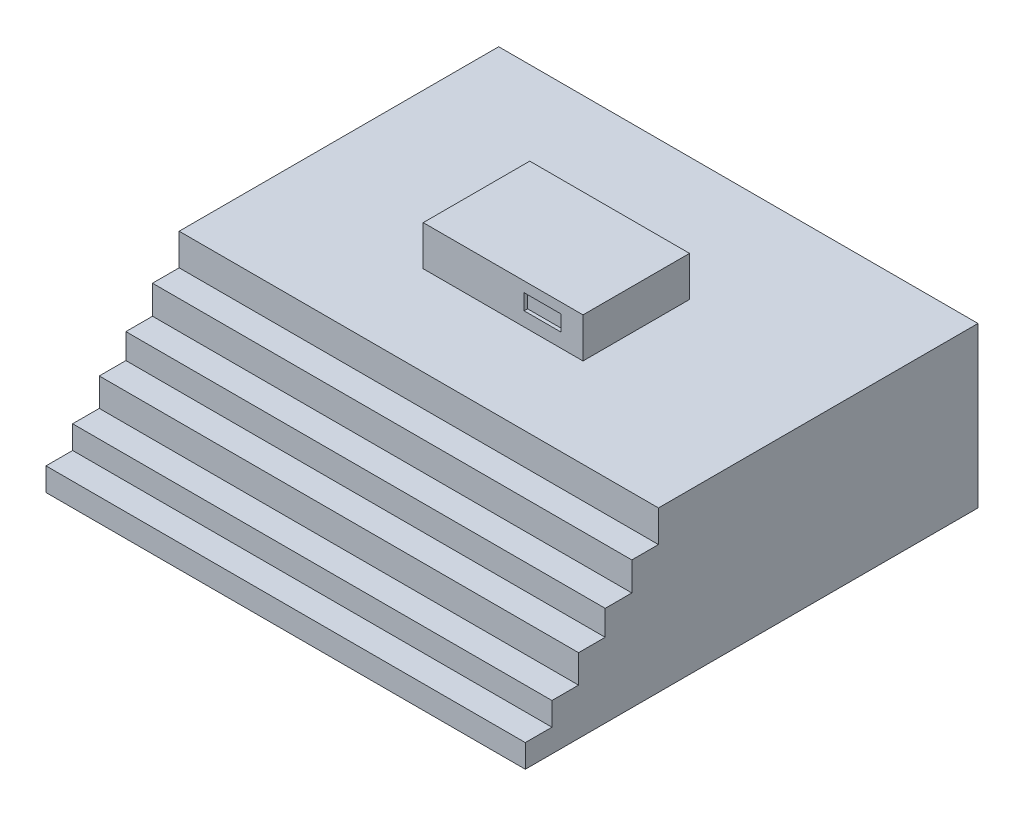
ISO-10303-21;
HEADER;
FILE_DESCRIPTION(('STEP AP214'),'2;1');
FILE_NAME('part.step','',(''),(''),'','','');
FILE_SCHEMA(('AUTOMOTIVE_DESIGN { 1 0 10303 214 1 1 1 1 }'));
ENDSEC;
DATA;
#1=APPLICATION_CONTEXT('core data for automotive mechanical design processes');
#2=APPLICATION_PROTOCOL_DEFINITION('international standard','automotive_design',2000,#1);
#3=PRODUCT_CONTEXT('',#1,'mechanical');
#4=PRODUCT('Part','Part','',(#3));
#5=PRODUCT_RELATED_PRODUCT_CATEGORY('part','',(#4));
#6=PRODUCT_DEFINITION_FORMATION('','',#4);
#7=PRODUCT_DEFINITION_CONTEXT('part definition',#1,'design');
#8=PRODUCT_DEFINITION('design','',#6,#7);
#9=PRODUCT_DEFINITION_SHAPE('','',#8);
#10=(LENGTH_UNIT() NAMED_UNIT(*) SI_UNIT(.MILLI.,.METRE.));
#11=(NAMED_UNIT(*) PLANE_ANGLE_UNIT() SI_UNIT($,.RADIAN.));
#12=(NAMED_UNIT(*) SI_UNIT($,.STERADIAN.) SOLID_ANGLE_UNIT());
#13=UNCERTAINTY_MEASURE_WITH_UNIT(LENGTH_MEASURE(1.E-05),#10,'distance_accuracy_value','');
#14=(GEOMETRIC_REPRESENTATION_CONTEXT(3) GLOBAL_UNCERTAINTY_ASSIGNED_CONTEXT((#13)) GLOBAL_UNIT_ASSIGNED_CONTEXT((#10,
#11,#12)) REPRESENTATION_CONTEXT('',''));
#15=CARTESIAN_POINT('',(0.,0.,0.));
#16=DIRECTION('',(0.,0.,1.));
#17=DIRECTION('',(1.,0.,0.));
#18=AXIS2_PLACEMENT_3D('',#15,#16,#17);
#19=CARTESIAN_POINT('',(-142.707892523808,785.764976231884,609.6));
#20=DIRECTION('',(0.,-1.,0.));
#21=DIRECTION('',(0.,0.,-1.));
#22=AXIS2_PLACEMENT_3D('',#19,#20,#21);
#23=PLANE('',#22);
#24=DIRECTION('',(-1.,0.,0.));
#25=VECTOR('',#24,1.);
#26=CARTESIAN_POINT('',(-142.707892523808,785.764976231884,0.));
#27=LINE('',#26,#25);
#28=CARTESIAN_POINT('',(771.692107476192,785.764976231884,0.));
#29=VERTEX_POINT('',#28);
#30=CARTESIAN_POINT('',(-142.707892523808,785.764976231884,0.));
#31=VERTEX_POINT('',#30);
#32=EDGE_CURVE('E397',#29,#31,#27,.T.);
#33=ORIENTED_EDGE('',*,*,#32,.T.);
#34=DIRECTION('',(0.,0.,-1.));
#35=VECTOR('',#34,1.);
#36=CARTESIAN_POINT('',(-142.707892523808,785.764976231884,609.6));
#37=LINE('',#36,#35);
#38=CARTESIAN_POINT('',(-142.707892523808,785.764976231884,609.6));
#39=VERTEX_POINT('',#38);
#40=EDGE_CURVE('E403',#39,#31,#37,.T.);
#41=ORIENTED_EDGE('',*,*,#40,.F.);
#42=DIRECTION('',(-1.,0.,0.));
#43=VECTOR('',#42,1.);
#44=CARTESIAN_POINT('',(-142.707892523808,785.764976231884,609.6));
#45=LINE('',#44,#43);
#46=CARTESIAN_POINT('',(771.692107476192,785.764976231884,609.6));
#47=VERTEX_POINT('',#46);
#48=EDGE_CURVE('E400',#47,#39,#45,.T.);
#49=ORIENTED_EDGE('',*,*,#48,.F.);
#50=DIRECTION('',(0.,0.,-1.));
#51=VECTOR('',#50,1.);
#52=CARTESIAN_POINT('',(771.692107476192,785.764976231884,609.6));
#53=LINE('',#52,#51);
#54=EDGE_CURVE('E418',#47,#29,#53,.T.);
#55=ORIENTED_EDGE('',*,*,#54,.T.);
#56=EDGE_LOOP('',(#33,#41,#49,#55));
#57=FACE_BOUND('',#56,.T.);
#58=DIRECTION('',(1.,0.,0.));
#59=VECTOR('',#58,1.);
#60=CARTESIAN_POINT('',(152.140679120784,785.764976231884,438.795909304022));
#61=LINE('',#60,#59);
#62=CARTESIAN_POINT('',(152.140679120784,785.764976231884,438.795909304022));
#63=VERTEX_POINT('',#62);
#64=CARTESIAN_POINT('',(456.940679120784,785.764976231884,438.795909304022));
#65=VERTEX_POINT('',#64);
#66=EDGE_CURVE('E65',#63,#65,#61,.T.);
#67=ORIENTED_EDGE('',*,*,#66,.F.);
#68=DIRECTION('',(0.,0.,1.));
#69=VECTOR('',#68,1.);
#70=CARTESIAN_POINT('',(152.140679120784,785.764976231884,235.595909304022));
#71=LINE('',#70,#69);
#72=CARTESIAN_POINT('',(152.140679120784,785.764976231884,235.595909304022));
#73=VERTEX_POINT('',#72);
#74=EDGE_CURVE('E247',#73,#63,#71,.T.);
#75=ORIENTED_EDGE('',*,*,#74,.F.);
#76=DIRECTION('',(1.,0.,0.));
#77=VECTOR('',#76,1.);
#78=CARTESIAN_POINT('',(152.140679120784,785.764976231884,235.595909304022));
#79=LINE('',#78,#77);
#80=CARTESIAN_POINT('',(456.940679120784,785.764976231884,235.595909304022));
#81=VERTEX_POINT('',#80);
#82=EDGE_CURVE('E265',#73,#81,#79,.T.);
#83=ORIENTED_EDGE('',*,*,#82,.T.);
#84=DIRECTION('',(0.,0.,1.));
#85=VECTOR('',#84,1.);
#86=CARTESIAN_POINT('',(456.940679120784,785.764976231884,235.595909304022));
#87=LINE('',#86,#85);
#88=EDGE_CURVE('E261',#81,#65,#87,.T.);
#89=ORIENTED_EDGE('',*,*,#88,.T.);
#90=EDGE_LOOP('',(#67,#75,#83,#89));
#91=FACE_BOUND('',#90,.T.);
#92=ADVANCED_FACE('F41',(#57,#91),#23,.F.);
#93=CARTESIAN_POINT('',(-142.707892523808,785.764976231884,609.6));
#94=DIRECTION('',(1.,0.,0.));
#95=DIRECTION('',(0.,0.,-1.));
#96=AXIS2_PLACEMENT_3D('',#93,#94,#95);
#97=PLANE('',#96);
#98=DIRECTION('',(0.,-1.,0.));
#99=VECTOR('',#98,1.);
#100=CARTESIAN_POINT('',(-142.707892523808,785.764976231884,0.));
#101=LINE('',#100,#99);
#102=CARTESIAN_POINT('',(-142.707892523808,480.964976231884,0.));
#103=VERTEX_POINT('',#102);
#104=EDGE_CURVE('E392',#31,#103,#101,.T.);
#105=ORIENTED_EDGE('',*,*,#104,.T.);
#106=DIRECTION('',(0.,0.,-1.));
#107=VECTOR('',#106,1.);
#108=CARTESIAN_POINT('',(-142.707892523808,480.964976231884,609.6));
#109=LINE('',#108,#107);
#110=CARTESIAN_POINT('',(-142.707892523808,480.964976231884,863.6));
#111=VERTEX_POINT('',#110);
#112=EDGE_CURVE('E11',#111,#103,#109,.T.);
#113=ORIENTED_EDGE('',*,*,#112,.F.);
#114=DIRECTION('',(0.,-1.,0.));
#115=VECTOR('',#114,1.);
#116=CARTESIAN_POINT('',(-142.707892523808,525.094881255979,863.6));
#117=LINE('',#116,#115);
#118=CARTESIAN_POINT('',(-142.707892523808,525.094881255979,863.6));
#119=VERTEX_POINT('',#118);
#120=EDGE_CURVE('E283',#119,#111,#117,.T.);
#121=ORIENTED_EDGE('',*,*,#120,.F.);
#122=DIRECTION('',(0.,0.,-1.));
#123=VECTOR('',#122,1.);
#124=CARTESIAN_POINT('',(-142.707892523808,525.094881255979,863.6));
#125=LINE('',#124,#123);
#126=CARTESIAN_POINT('',(-142.707892523808,525.094881255979,812.8));
#127=VERTEX_POINT('',#126);
#128=EDGE_CURVE('E297',#119,#127,#125,.T.);
#129=ORIENTED_EDGE('',*,*,#128,.T.);
#130=DIRECTION('',(0.,-1.,0.));
#131=VECTOR('',#130,1.);
#132=CARTESIAN_POINT('',(-142.707892523808,569.224786280074,812.8));
#133=LINE('',#132,#131);
#134=CARTESIAN_POINT('',(-142.707892523808,569.224786280074,812.8));
#135=VERTEX_POINT('',#134);
#136=EDGE_CURVE('E309',#135,#127,#133,.T.);
#137=ORIENTED_EDGE('',*,*,#136,.F.);
#138=DIRECTION('',(0.,0.,-1.));
#139=VECTOR('',#138,1.);
#140=CARTESIAN_POINT('',(-142.707892523808,569.224786280074,812.8));
#141=LINE('',#140,#139);
#142=CARTESIAN_POINT('',(-142.707892523808,569.224786280074,762.));
#143=VERTEX_POINT('',#142);
#144=EDGE_CURVE('E318',#135,#143,#141,.T.);
#145=ORIENTED_EDGE('',*,*,#144,.T.);
#146=DIRECTION('',(0.,-1.,0.));
#147=VECTOR('',#146,1.);
#148=CARTESIAN_POINT('',(-142.707892523808,622.834497284574,762.));
#149=LINE('',#148,#147);
#150=CARTESIAN_POINT('',(-142.707892523808,622.834497284574,762.));
#151=VERTEX_POINT('',#150);
#152=EDGE_CURVE('E330',#151,#143,#149,.T.);
#153=ORIENTED_EDGE('',*,*,#152,.F.);
#154=DIRECTION('',(0.,0.,-1.));
#155=VECTOR('',#154,1.);
#156=CARTESIAN_POINT('',(-142.707892523808,622.834497284574,762.));
#157=LINE('',#156,#155);
#158=CARTESIAN_POINT('',(-142.707892523808,622.834497284574,711.2));
#159=VERTEX_POINT('',#158);
#160=EDGE_CURVE('E339',#151,#159,#157,.T.);
#161=ORIENTED_EDGE('',*,*,#160,.T.);
#162=DIRECTION('',(0.,-1.,0.));
#163=VECTOR('',#162,1.);
#164=CARTESIAN_POINT('',(-142.707892523808,670.700310681449,711.2));
#165=LINE('',#164,#163);
#166=CARTESIAN_POINT('',(-142.707892523808,670.700310681449,711.2));
#167=VERTEX_POINT('',#166);
#168=EDGE_CURVE('E351',#167,#159,#165,.T.);
#169=ORIENTED_EDGE('',*,*,#168,.F.);
#170=DIRECTION('',(0.,0.,-1.));
#171=VECTOR('',#170,1.);
#172=CARTESIAN_POINT('',(-142.707892523808,670.700310681449,711.2));
#173=LINE('',#172,#171);
#174=CARTESIAN_POINT('',(-142.707892523808,670.700310681449,660.4));
#175=VERTEX_POINT('',#174);
#176=EDGE_CURVE('E360',#167,#175,#173,.T.);
#177=ORIENTED_EDGE('',*,*,#176,.T.);
#178=DIRECTION('',(0.,-1.,0.));
#179=VECTOR('',#178,1.);
#180=CARTESIAN_POINT('',(-142.707892523808,725.267337953888,660.4));
#181=LINE('',#180,#179);
#182=CARTESIAN_POINT('',(-142.707892523808,725.267337953888,660.4));
#183=VERTEX_POINT('',#182);
#184=EDGE_CURVE('E372',#183,#175,#181,.T.);
#185=ORIENTED_EDGE('',*,*,#184,.F.);
#186=DIRECTION('',(0.,0.,-1.));
#187=VECTOR('',#186,1.);
#188=CARTESIAN_POINT('',(-142.707892523808,725.267337953888,660.4));
#189=LINE('',#188,#187);
#190=CARTESIAN_POINT('',(-142.707892523808,725.267337953888,609.6));
#191=VERTEX_POINT('',#190);
#192=EDGE_CURVE('E381',#183,#191,#189,.T.);
#193=ORIENTED_EDGE('',*,*,#192,.T.);
#194=DIRECTION('',(0.,-1.,0.));
#195=VECTOR('',#194,1.);
#196=CARTESIAN_POINT('',(-142.707892523808,785.764976231884,609.6));
#197=LINE('',#196,#195);
#198=EDGE_CURVE('E393',#39,#191,#197,.T.);
#199=ORIENTED_EDGE('',*,*,#198,.F.);
#200=ORIENTED_EDGE('',*,*,#40,.T.);
#201=EDGE_LOOP('',(#105,#113,#121,#129,#137,#145,#153,#161,#169,#177,#185,#193,#199,#200));
#202=FACE_BOUND('',#201,.T.);
#203=ADVANCED_FACE('F43',(#202),#97,.F.);
#204=CARTESIAN_POINT('',(-142.707892523808,480.964976231884,609.6));
#205=DIRECTION('',(0.,1.,0.));
#206=DIRECTION('',(-1.,0.,0.));
#207=AXIS2_PLACEMENT_3D('',#204,#205,#206);
#208=PLANE('',#207);
#209=DIRECTION('',(1.,0.,0.));
#210=VECTOR('',#209,1.);
#211=CARTESIAN_POINT('',(-142.707892523808,480.964976231884,0.));
#212=LINE('',#211,#210);
#213=CARTESIAN_POINT('',(771.692107476192,480.964976231884,0.));
#214=VERTEX_POINT('',#213);
#215=EDGE_CURVE('E407',#103,#214,#212,.T.);
#216=ORIENTED_EDGE('',*,*,#215,.T.);
#217=DIRECTION('',(0.,0.,-1.));
#218=VECTOR('',#217,1.);
#219=CARTESIAN_POINT('',(771.692107476192,480.964976231884,609.6));
#220=LINE('',#219,#218);
#221=CARTESIAN_POINT('',(771.692107476192,480.964976231884,863.6));
#222=VERTEX_POINT('',#221);
#223=EDGE_CURVE('E50',#222,#214,#220,.T.);
#224=ORIENTED_EDGE('',*,*,#223,.F.);
#225=DIRECTION('',(1.,0.,0.));
#226=VECTOR('',#225,1.);
#227=CARTESIAN_POINT('',(-142.707892523808,480.964976231884,863.6));
#228=LINE('',#227,#226);
#229=EDGE_CURVE('E287',#111,#222,#228,.T.);
#230=ORIENTED_EDGE('',*,*,#229,.F.);
#231=ORIENTED_EDGE('',*,*,#112,.T.);
#232=EDGE_LOOP('',(#216,#224,#230,#231));
#233=FACE_BOUND('',#232,.T.);
#234=ADVANCED_FACE('F486',(#233),#208,.F.);
#235=CARTESIAN_POINT('',(771.692107476192,785.764976231884,609.6));
#236=DIRECTION('',(-1.,0.,0.));
#237=DIRECTION('',(0.,0.,1.));
#238=AXIS2_PLACEMENT_3D('',#235,#236,#237);
#239=PLANE('',#238);
#240=DIRECTION('',(0.,1.,0.));
#241=VECTOR('',#240,1.);
#242=CARTESIAN_POINT('',(771.692107476192,785.764976231884,0.));
#243=LINE('',#242,#241);
#244=EDGE_CURVE('E410',#214,#29,#243,.T.);
#245=ORIENTED_EDGE('',*,*,#244,.T.);
#246=ORIENTED_EDGE('',*,*,#54,.F.);
#247=DIRECTION('',(0.,1.,0.));
#248=VECTOR('',#247,1.);
#249=CARTESIAN_POINT('',(771.692107476192,785.764976231884,609.6));
#250=LINE('',#249,#248);
#251=CARTESIAN_POINT('',(771.692107476192,725.267337953888,609.6));
#252=VERTEX_POINT('',#251);
#253=EDGE_CURVE('E396',#252,#47,#250,.T.);
#254=ORIENTED_EDGE('',*,*,#253,.F.);
#255=DIRECTION('',(0.,0.,-1.));
#256=VECTOR('',#255,1.);
#257=CARTESIAN_POINT('',(771.692107476192,725.267337953888,660.4));
#258=LINE('',#257,#256);
#259=CARTESIAN_POINT('',(771.692107476192,725.267337953888,660.4));
#260=VERTEX_POINT('',#259);
#261=EDGE_CURVE('E388',#260,#252,#258,.T.);
#262=ORIENTED_EDGE('',*,*,#261,.F.);
#263=DIRECTION('',(0.,1.,0.));
#264=VECTOR('',#263,1.);
#265=CARTESIAN_POINT('',(771.692107476192,725.267337953888,660.4));
#266=LINE('',#265,#264);
#267=CARTESIAN_POINT('',(771.692107476192,670.700310681449,660.4));
#268=VERTEX_POINT('',#267);
#269=EDGE_CURVE('E375',#268,#260,#266,.T.);
#270=ORIENTED_EDGE('',*,*,#269,.F.);
#271=DIRECTION('',(0.,0.,-1.));
#272=VECTOR('',#271,1.);
#273=CARTESIAN_POINT('',(771.692107476192,670.700310681449,711.2));
#274=LINE('',#273,#272);
#275=CARTESIAN_POINT('',(771.692107476192,670.700310681449,711.2));
#276=VERTEX_POINT('',#275);
#277=EDGE_CURVE('E367',#276,#268,#274,.T.);
#278=ORIENTED_EDGE('',*,*,#277,.F.);
#279=DIRECTION('',(0.,1.,0.));
#280=VECTOR('',#279,1.);
#281=CARTESIAN_POINT('',(771.692107476192,670.700310681449,711.2));
#282=LINE('',#281,#280);
#283=CARTESIAN_POINT('',(771.692107476192,622.834497284574,711.2));
#284=VERTEX_POINT('',#283);
#285=EDGE_CURVE('E354',#284,#276,#282,.T.);
#286=ORIENTED_EDGE('',*,*,#285,.F.);
#287=DIRECTION('',(0.,0.,-1.));
#288=VECTOR('',#287,1.);
#289=CARTESIAN_POINT('',(771.692107476192,622.834497284574,762.));
#290=LINE('',#289,#288);
#291=CARTESIAN_POINT('',(771.692107476192,622.834497284574,762.));
#292=VERTEX_POINT('',#291);
#293=EDGE_CURVE('E346',#292,#284,#290,.T.);
#294=ORIENTED_EDGE('',*,*,#293,.F.);
#295=DIRECTION('',(0.,1.,0.));
#296=VECTOR('',#295,1.);
#297=CARTESIAN_POINT('',(771.692107476192,622.834497284574,762.));
#298=LINE('',#297,#296);
#299=CARTESIAN_POINT('',(771.692107476192,569.224786280074,762.));
#300=VERTEX_POINT('',#299);
#301=EDGE_CURVE('E333',#300,#292,#298,.T.);
#302=ORIENTED_EDGE('',*,*,#301,.F.);
#303=DIRECTION('',(0.,0.,-1.));
#304=VECTOR('',#303,1.);
#305=CARTESIAN_POINT('',(771.692107476192,569.224786280074,812.8));
#306=LINE('',#305,#304);
#307=CARTESIAN_POINT('',(771.692107476192,569.224786280074,812.8));
#308=VERTEX_POINT('',#307);
#309=EDGE_CURVE('E325',#308,#300,#306,.T.);
#310=ORIENTED_EDGE('',*,*,#309,.F.);
#311=DIRECTION('',(0.,1.,0.));
#312=VECTOR('',#311,1.);
#313=CARTESIAN_POINT('',(771.692107476192,569.224786280074,812.8));
#314=LINE('',#313,#312);
#315=CARTESIAN_POINT('',(771.692107476192,525.094881255979,812.8));
#316=VERTEX_POINT('',#315);
#317=EDGE_CURVE('E312',#316,#308,#314,.T.);
#318=ORIENTED_EDGE('',*,*,#317,.F.);
#319=DIRECTION('',(0.,0.,-1.));
#320=VECTOR('',#319,1.);
#321=CARTESIAN_POINT('',(771.692107476192,525.094881255979,863.6));
#322=LINE('',#321,#320);
#323=CARTESIAN_POINT('',(771.692107476192,525.094881255979,863.6));
#324=VERTEX_POINT('',#323);
#325=EDGE_CURVE('E304',#324,#316,#322,.T.);
#326=ORIENTED_EDGE('',*,*,#325,.F.);
#327=DIRECTION('',(0.,1.,0.));
#328=VECTOR('',#327,1.);
#329=CARTESIAN_POINT('',(771.692107476192,525.094881255979,863.6));
#330=LINE('',#329,#328);
#331=EDGE_CURVE('E291',#222,#324,#330,.T.);
#332=ORIENTED_EDGE('',*,*,#331,.F.);
#333=ORIENTED_EDGE('',*,*,#223,.T.);
#334=EDGE_LOOP('',(#245,#246,#254,#262,#270,#278,#286,#294,#302,#310,#318,#326,#332,#333));
#335=FACE_BOUND('',#334,.T.);
#336=ADVANCED_FACE('F426',(#335),#239,.F.);
#337=CARTESIAN_POINT('',(0.,0.,609.6));
#338=DIRECTION('',(0.,0.,1.));
#339=DIRECTION('',(1.,0.,0.));
#340=AXIS2_PLACEMENT_3D('',#337,#338,#339);
#341=PLANE('',#340);
#342=DIRECTION('',(-1.,0.,0.));
#343=VECTOR('',#342,1.);
#344=CARTESIAN_POINT('',(-142.707892523808,725.267337953888,609.6));
#345=LINE('',#344,#343);
#346=EDGE_CURVE('E371',#252,#191,#345,.T.);
#347=ORIENTED_EDGE('',*,*,#346,.F.);
#348=ORIENTED_EDGE('',*,*,#253,.T.);
#349=ORIENTED_EDGE('',*,*,#48,.T.);
#350=ORIENTED_EDGE('',*,*,#198,.T.);
#351=EDGE_LOOP('',(#347,#348,#349,#350));
#352=FACE_BOUND('',#351,.T.);
#353=ADVANCED_FACE('F444',(#352),#341,.T.);
#354=CARTESIAN_POINT('',(0.,0.,0.));
#355=DIRECTION('',(0.,0.,1.));
#356=DIRECTION('',(1.,0.,0.));
#357=AXIS2_PLACEMENT_3D('',#354,#355,#356);
#358=PLANE('',#357);
#359=ORIENTED_EDGE('',*,*,#104,.F.);
#360=ORIENTED_EDGE('',*,*,#32,.F.);
#361=ORIENTED_EDGE('',*,*,#244,.F.);
#362=ORIENTED_EDGE('',*,*,#215,.F.);
#363=EDGE_LOOP('',(#359,#360,#361,#362));
#364=FACE_BOUND('',#363,.T.);
#365=ADVANCED_FACE('F434',(#364),#358,.F.);
#366=CARTESIAN_POINT('',(-142.707892523808,725.267337953888,660.4));
#367=DIRECTION('',(0.,-1.,0.));
#368=DIRECTION('',(0.,0.,-1.));
#369=AXIS2_PLACEMENT_3D('',#366,#367,#368);
#370=PLANE('',#369);
#371=ORIENTED_EDGE('',*,*,#346,.T.);
#372=ORIENTED_EDGE('',*,*,#192,.F.);
#373=DIRECTION('',(-1.,0.,0.));
#374=VECTOR('',#373,1.);
#375=CARTESIAN_POINT('',(-142.707892523808,725.267337953888,660.4));
#376=LINE('',#375,#374);
#377=EDGE_CURVE('E378',#260,#183,#376,.T.);
#378=ORIENTED_EDGE('',*,*,#377,.F.);
#379=ORIENTED_EDGE('',*,*,#261,.T.);
#380=EDGE_LOOP('',(#371,#372,#378,#379));
#381=FACE_BOUND('',#380,.T.);
#382=ADVANCED_FACE('F447',(#381),#370,.F.);
#383=CARTESIAN_POINT('',(0.,0.,660.4));
#384=DIRECTION('',(0.,0.,1.));
#385=DIRECTION('',(1.,0.,0.));
#386=AXIS2_PLACEMENT_3D('',#383,#384,#385);
#387=PLANE('',#386);
#388=DIRECTION('',(-1.,0.,0.));
#389=VECTOR('',#388,1.);
#390=CARTESIAN_POINT('',(-142.707892523808,670.700310681449,660.4));
#391=LINE('',#390,#389);
#392=EDGE_CURVE('E350',#268,#175,#391,.T.);
#393=ORIENTED_EDGE('',*,*,#392,.F.);
#394=ORIENTED_EDGE('',*,*,#269,.T.);
#395=ORIENTED_EDGE('',*,*,#377,.T.);
#396=ORIENTED_EDGE('',*,*,#184,.T.);
#397=EDGE_LOOP('',(#393,#394,#395,#396));
#398=FACE_BOUND('',#397,.T.);
#399=ADVANCED_FACE('F487',(#398),#387,.T.);
#400=CARTESIAN_POINT('',(-142.707892523808,670.700310681449,711.2));
#401=DIRECTION('',(0.,-1.,0.));
#402=DIRECTION('',(0.,0.,-1.));
#403=AXIS2_PLACEMENT_3D('',#400,#401,#402);
#404=PLANE('',#403);
#405=ORIENTED_EDGE('',*,*,#392,.T.);
#406=ORIENTED_EDGE('',*,*,#176,.F.);
#407=DIRECTION('',(-1.,0.,0.));
#408=VECTOR('',#407,1.);
#409=CARTESIAN_POINT('',(-142.707892523808,670.700310681449,711.2));
#410=LINE('',#409,#408);
#411=EDGE_CURVE('E357',#276,#167,#410,.T.);
#412=ORIENTED_EDGE('',*,*,#411,.F.);
#413=ORIENTED_EDGE('',*,*,#277,.T.);
#414=EDGE_LOOP('',(#405,#406,#412,#413));
#415=FACE_BOUND('',#414,.T.);
#416=ADVANCED_FACE('F456',(#415),#404,.F.);
#417=CARTESIAN_POINT('',(0.,0.,711.2));
#418=DIRECTION('',(0.,0.,1.));
#419=DIRECTION('',(1.,0.,0.));
#420=AXIS2_PLACEMENT_3D('',#417,#418,#419);
#421=PLANE('',#420);
#422=DIRECTION('',(-1.,0.,0.));
#423=VECTOR('',#422,1.);
#424=CARTESIAN_POINT('',(-142.707892523808,622.834497284574,711.2));
#425=LINE('',#424,#423);
#426=EDGE_CURVE('E329',#284,#159,#425,.T.);
#427=ORIENTED_EDGE('',*,*,#426,.F.);
#428=ORIENTED_EDGE('',*,*,#285,.T.);
#429=ORIENTED_EDGE('',*,*,#411,.T.);
#430=ORIENTED_EDGE('',*,*,#168,.T.);
#431=EDGE_LOOP('',(#427,#428,#429,#430));
#432=FACE_BOUND('',#431,.T.);
#433=ADVANCED_FACE('F460',(#432),#421,.T.);
#434=CARTESIAN_POINT('',(-142.707892523808,622.834497284574,762.));
#435=DIRECTION('',(0.,-1.,0.));
#436=DIRECTION('',(0.,0.,-1.));
#437=AXIS2_PLACEMENT_3D('',#434,#435,#436);
#438=PLANE('',#437);
#439=ORIENTED_EDGE('',*,*,#426,.T.);
#440=ORIENTED_EDGE('',*,*,#160,.F.);
#441=DIRECTION('',(-1.,0.,0.));
#442=VECTOR('',#441,1.);
#443=CARTESIAN_POINT('',(-142.707892523808,622.834497284574,762.));
#444=LINE('',#443,#442);
#445=EDGE_CURVE('E336',#292,#151,#444,.T.);
#446=ORIENTED_EDGE('',*,*,#445,.F.);
#447=ORIENTED_EDGE('',*,*,#293,.T.);
#448=EDGE_LOOP('',(#439,#440,#446,#447));
#449=FACE_BOUND('',#448,.T.);
#450=ADVANCED_FACE('F465',(#449),#438,.F.);
#451=CARTESIAN_POINT('',(0.,0.,762.));
#452=DIRECTION('',(0.,0.,1.));
#453=DIRECTION('',(1.,0.,0.));
#454=AXIS2_PLACEMENT_3D('',#451,#452,#453);
#455=PLANE('',#454);
#456=DIRECTION('',(-1.,0.,0.));
#457=VECTOR('',#456,1.);
#458=CARTESIAN_POINT('',(-142.707892523808,569.224786280074,762.));
#459=LINE('',#458,#457);
#460=EDGE_CURVE('E308',#300,#143,#459,.T.);
#461=ORIENTED_EDGE('',*,*,#460,.F.);
#462=ORIENTED_EDGE('',*,*,#301,.T.);
#463=ORIENTED_EDGE('',*,*,#445,.T.);
#464=ORIENTED_EDGE('',*,*,#152,.T.);
#465=EDGE_LOOP('',(#461,#462,#463,#464));
#466=FACE_BOUND('',#465,.T.);
#467=ADVANCED_FACE('F469',(#466),#455,.T.);
#468=CARTESIAN_POINT('',(-142.707892523808,569.224786280074,812.8));
#469=DIRECTION('',(0.,-1.,0.));
#470=DIRECTION('',(0.,0.,-1.));
#471=AXIS2_PLACEMENT_3D('',#468,#469,#470);
#472=PLANE('',#471);
#473=ORIENTED_EDGE('',*,*,#460,.T.);
#474=ORIENTED_EDGE('',*,*,#144,.F.);
#475=DIRECTION('',(-1.,0.,0.));
#476=VECTOR('',#475,1.);
#477=CARTESIAN_POINT('',(-142.707892523808,569.224786280074,812.8));
#478=LINE('',#477,#476);
#479=EDGE_CURVE('E315',#308,#135,#478,.T.);
#480=ORIENTED_EDGE('',*,*,#479,.F.);
#481=ORIENTED_EDGE('',*,*,#309,.T.);
#482=EDGE_LOOP('',(#473,#474,#480,#481));
#483=FACE_BOUND('',#482,.T.);
#484=ADVANCED_FACE('F474',(#483),#472,.F.);
#485=CARTESIAN_POINT('',(0.,0.,812.8));
#486=DIRECTION('',(0.,0.,1.));
#487=DIRECTION('',(1.,0.,0.));
#488=AXIS2_PLACEMENT_3D('',#485,#486,#487);
#489=PLANE('',#488);
#490=DIRECTION('',(-1.,0.,0.));
#491=VECTOR('',#490,1.);
#492=CARTESIAN_POINT('',(-142.707892523808,525.094881255979,812.8));
#493=LINE('',#492,#491);
#494=EDGE_CURVE('E282',#316,#127,#493,.T.);
#495=ORIENTED_EDGE('',*,*,#494,.F.);
#496=ORIENTED_EDGE('',*,*,#317,.T.);
#497=ORIENTED_EDGE('',*,*,#479,.T.);
#498=ORIENTED_EDGE('',*,*,#136,.T.);
#499=EDGE_LOOP('',(#495,#496,#497,#498));
#500=FACE_BOUND('',#499,.T.);
#501=ADVANCED_FACE('F478',(#500),#489,.T.);
#502=CARTESIAN_POINT('',(-142.707892523808,525.094881255979,863.6));
#503=DIRECTION('',(0.,-1.,0.));
#504=DIRECTION('',(0.,0.,-1.));
#505=AXIS2_PLACEMENT_3D('',#502,#503,#504);
#506=PLANE('',#505);
#507=ORIENTED_EDGE('',*,*,#494,.T.);
#508=ORIENTED_EDGE('',*,*,#128,.F.);
#509=DIRECTION('',(-1.,0.,0.));
#510=VECTOR('',#509,1.);
#511=CARTESIAN_POINT('',(-142.707892523808,525.094881255979,863.6));
#512=LINE('',#511,#510);
#513=EDGE_CURVE('E294',#324,#119,#512,.T.);
#514=ORIENTED_EDGE('',*,*,#513,.F.);
#515=ORIENTED_EDGE('',*,*,#325,.T.);
#516=EDGE_LOOP('',(#507,#508,#514,#515));
#517=FACE_BOUND('',#516,.T.);
#518=ADVANCED_FACE('F481',(#517),#506,.F.);
#519=CARTESIAN_POINT('',(0.,0.,863.6));
#520=DIRECTION('',(0.,0.,1.));
#521=DIRECTION('',(1.,0.,0.));
#522=AXIS2_PLACEMENT_3D('',#519,#520,#521);
#523=PLANE('',#522);
#524=ORIENTED_EDGE('',*,*,#120,.T.);
#525=ORIENTED_EDGE('',*,*,#229,.T.);
#526=ORIENTED_EDGE('',*,*,#331,.T.);
#527=ORIENTED_EDGE('',*,*,#513,.T.);
#528=EDGE_LOOP('',(#524,#525,#526,#527));
#529=FACE_BOUND('',#528,.T.);
#530=ADVANCED_FACE('F485',(#529),#523,.T.);
#531=CARTESIAN_POINT('',(152.140679120784,861.964976231884,438.795909304022));
#532=DIRECTION('',(0.,0.,-1.));
#533=DIRECTION('',(-1.,0.,0.));
#534=AXIS2_PLACEMENT_3D('',#531,#532,#533);
#535=PLANE('',#534);
#536=DIRECTION('',(1.,0.,0.));
#537=VECTOR('',#536,1.);
#538=CARTESIAN_POINT('',(344.707122212933,812.488030004223,438.795909304022));
#539=LINE('',#538,#537);
#540=CARTESIAN_POINT('',(344.707122212933,812.488030004223,438.795909304022));
#541=VERTEX_POINT('',#540);
#542=CARTESIAN_POINT('',(414.707122212933,812.488030004223,438.795909304022));
#543=VERTEX_POINT('',#542);
#544=EDGE_CURVE('E229',#541,#543,#539,.T.);
#545=ORIENTED_EDGE('',*,*,#544,.F.);
#546=DIRECTION('',(0.,-1.,0.));
#547=VECTOR('',#546,1.);
#548=CARTESIAN_POINT('',(344.707122212933,842.488030004223,438.795909304022));
#549=LINE('',#548,#547);
#550=CARTESIAN_POINT('',(344.707122212933,842.488030004223,438.795909304022));
#551=VERTEX_POINT('',#550);
#552=EDGE_CURVE('E57',#551,#541,#549,.T.);
#553=ORIENTED_EDGE('',*,*,#552,.F.);
#554=DIRECTION('',(-1.,0.,0.));
#555=VECTOR('',#554,1.);
#556=CARTESIAN_POINT('',(344.707122212933,842.488030004223,438.795909304022));
#557=LINE('',#556,#555);
#558=CARTESIAN_POINT('',(414.707122212933,842.488030004223,438.795909304022));
#559=VERTEX_POINT('',#558);
#560=EDGE_CURVE('E216',#559,#551,#557,.T.);
#561=ORIENTED_EDGE('',*,*,#560,.F.);
#562=DIRECTION('',(0.,1.,0.));
#563=VECTOR('',#562,1.);
#564=CARTESIAN_POINT('',(414.707122212933,842.488030004223,438.795909304022));
#565=LINE('',#564,#563);
#566=EDGE_CURVE('E220',#543,#559,#565,.T.);
#567=ORIENTED_EDGE('',*,*,#566,.F.);
#568=EDGE_LOOP('',(#545,#553,#561,#567));
#569=FACE_BOUND('',#568,.T.);
#570=ORIENTED_EDGE('',*,*,#66,.T.);
#571=DIRECTION('',(0.,-1.,0.));
#572=VECTOR('',#571,1.);
#573=CARTESIAN_POINT('',(456.940679120784,861.964976231884,438.795909304022));
#574=LINE('',#573,#572);
#575=CARTESIAN_POINT('',(456.940679120784,861.964976231884,438.795909304022));
#576=VERTEX_POINT('',#575);
#577=EDGE_CURVE('E279',#576,#65,#574,.T.);
#578=ORIENTED_EDGE('',*,*,#577,.F.);
#579=DIRECTION('',(1.,0.,0.));
#580=VECTOR('',#579,1.);
#581=CARTESIAN_POINT('',(152.140679120784,861.964976231884,438.795909304022));
#582=LINE('',#581,#580);
#583=CARTESIAN_POINT('',(152.140679120784,861.964976231884,438.795909304022));
#584=VERTEX_POINT('',#583);
#585=EDGE_CURVE('E243',#584,#576,#582,.T.);
#586=ORIENTED_EDGE('',*,*,#585,.F.);
#587=DIRECTION('',(0.,-1.,0.));
#588=VECTOR('',#587,1.);
#589=CARTESIAN_POINT('',(152.140679120784,861.964976231884,438.795909304022));
#590=LINE('',#589,#588);
#591=EDGE_CURVE('E258',#584,#63,#590,.T.);
#592=ORIENTED_EDGE('',*,*,#591,.T.);
#593=EDGE_LOOP('',(#570,#578,#586,#592));
#594=FACE_BOUND('',#593,.T.);
#595=ADVANCED_FACE('F593',(#569,#594),#535,.F.);
#596=CARTESIAN_POINT('',(456.940679120784,861.964976231884,235.595909304022));
#597=DIRECTION('',(1.,0.,0.));
#598=DIRECTION('',(0.,0.,-1.));
#599=AXIS2_PLACEMENT_3D('',#596,#597,#598);
#600=PLANE('',#599);
#601=ORIENTED_EDGE('',*,*,#88,.F.);
#602=DIRECTION('',(0.,-1.,0.));
#603=VECTOR('',#602,1.);
#604=CARTESIAN_POINT('',(456.940679120784,861.964976231884,235.595909304022));
#605=LINE('',#604,#603);
#606=CARTESIAN_POINT('',(456.940679120784,861.964976231884,235.595909304022));
#607=VERTEX_POINT('',#606);
#608=EDGE_CURVE('E276',#607,#81,#605,.T.);
#609=ORIENTED_EDGE('',*,*,#608,.F.);
#610=DIRECTION('',(0.,0.,1.));
#611=VECTOR('',#610,1.);
#612=CARTESIAN_POINT('',(456.940679120784,861.964976231884,235.595909304022));
#613=LINE('',#612,#611);
#614=EDGE_CURVE('E246',#607,#576,#613,.T.);
#615=ORIENTED_EDGE('',*,*,#614,.T.);
#616=ORIENTED_EDGE('',*,*,#577,.T.);
#617=EDGE_LOOP('',(#601,#609,#615,#616));
#618=FACE_BOUND('',#617,.T.);
#619=ADVANCED_FACE('F623',(#618),#600,.T.);
#620=CARTESIAN_POINT('',(152.140679120784,861.964976231884,235.595909304022));
#621=DIRECTION('',(0.,0.,-1.));
#622=DIRECTION('',(-1.,0.,0.));
#623=AXIS2_PLACEMENT_3D('',#620,#621,#622);
#624=PLANE('',#623);
#625=ORIENTED_EDGE('',*,*,#82,.F.);
#626=DIRECTION('',(0.,-1.,0.));
#627=VECTOR('',#626,1.);
#628=CARTESIAN_POINT('',(152.140679120784,861.964976231884,235.595909304022));
#629=LINE('',#628,#627);
#630=CARTESIAN_POINT('',(152.140679120784,861.964976231884,235.595909304022));
#631=VERTEX_POINT('',#630);
#632=EDGE_CURVE('E273',#631,#73,#629,.T.);
#633=ORIENTED_EDGE('',*,*,#632,.F.);
#634=DIRECTION('',(1.,0.,0.));
#635=VECTOR('',#634,1.);
#636=CARTESIAN_POINT('',(152.140679120784,861.964976231884,235.595909304022));
#637=LINE('',#636,#635);
#638=EDGE_CURVE('E251',#631,#607,#637,.T.);
#639=ORIENTED_EDGE('',*,*,#638,.T.);
#640=ORIENTED_EDGE('',*,*,#608,.T.);
#641=EDGE_LOOP('',(#625,#633,#639,#640));
#642=FACE_BOUND('',#641,.T.);
#643=ADVANCED_FACE('F611',(#642),#624,.T.);
#644=CARTESIAN_POINT('',(152.140679120784,861.964976231884,235.595909304022));
#645=DIRECTION('',(1.,0.,0.));
#646=DIRECTION('',(0.,0.,-1.));
#647=AXIS2_PLACEMENT_3D('',#644,#645,#646);
#648=PLANE('',#647);
#649=ORIENTED_EDGE('',*,*,#74,.T.);
#650=ORIENTED_EDGE('',*,*,#591,.F.);
#651=DIRECTION('',(0.,0.,1.));
#652=VECTOR('',#651,1.);
#653=CARTESIAN_POINT('',(152.140679120784,861.964976231884,235.595909304022));
#654=LINE('',#653,#652);
#655=EDGE_CURVE('E255',#631,#584,#654,.T.);
#656=ORIENTED_EDGE('',*,*,#655,.F.);
#657=ORIENTED_EDGE('',*,*,#632,.T.);
#658=EDGE_LOOP('',(#649,#650,#656,#657));
#659=FACE_BOUND('',#658,.T.);
#660=ADVANCED_FACE('F605',(#659),#648,.F.);
#661=CARTESIAN_POINT('',(0.,861.964976231884,0.));
#662=DIRECTION('',(0.,-1.,0.));
#663=DIRECTION('',(0.,0.,-1.));
#664=AXIS2_PLACEMENT_3D('',#661,#662,#663);
#665=PLANE('',#664);
#666=ORIENTED_EDGE('',*,*,#585,.T.);
#667=ORIENTED_EDGE('',*,*,#614,.F.);
#668=ORIENTED_EDGE('',*,*,#638,.F.);
#669=ORIENTED_EDGE('',*,*,#655,.T.);
#670=EDGE_LOOP('',(#666,#667,#668,#669));
#671=FACE_BOUND('',#670,.T.);
#672=ADVANCED_FACE('F610',(#671),#665,.F.);
#673=CARTESIAN_POINT('',(344.707122212933,842.488030004223,432.191909304022));
#674=DIRECTION('',(-1.,0.,0.));
#675=DIRECTION('',(0.,0.,1.));
#676=AXIS2_PLACEMENT_3D('',#673,#674,#675);
#677=PLANE('',#676);
#678=ORIENTED_EDGE('',*,*,#552,.T.);
#679=DIRECTION('',(0.,0.,1.));
#680=VECTOR('',#679,1.);
#681=CARTESIAN_POINT('',(344.707122212933,812.488030004223,432.191909304022));
#682=LINE('',#681,#680);
#683=CARTESIAN_POINT('',(344.707122212933,812.488030004223,432.191909304022));
#684=VERTEX_POINT('',#683);
#685=EDGE_CURVE('E191',#684,#541,#682,.T.);
#686=ORIENTED_EDGE('',*,*,#685,.F.);
#687=DIRECTION('',(0.,-1.,0.));
#688=VECTOR('',#687,1.);
#689=CARTESIAN_POINT('',(344.707122212933,842.488030004223,432.191909304022));
#690=LINE('',#689,#688);
#691=CARTESIAN_POINT('',(344.707122212933,842.488030004223,432.191909304022));
#692=VERTEX_POINT('',#691);
#693=EDGE_CURVE('E195',#692,#684,#690,.T.);
#694=ORIENTED_EDGE('',*,*,#693,.F.);
#695=DIRECTION('',(0.,0.,1.));
#696=VECTOR('',#695,1.);
#697=CARTESIAN_POINT('',(344.707122212933,842.488030004223,432.191909304022));
#698=LINE('',#697,#696);
#699=EDGE_CURVE('E235',#692,#551,#698,.T.);
#700=ORIENTED_EDGE('',*,*,#699,.T.);
#701=EDGE_LOOP('',(#678,#686,#694,#700));
#702=FACE_BOUND('',#701,.T.);
#703=ADVANCED_FACE('F193',(#702),#677,.F.);
#704=CARTESIAN_POINT('',(344.707122212933,842.488030004223,432.191909304022));
#705=DIRECTION('',(0.,1.,0.));
#706=DIRECTION('',(0.,0.,1.));
#707=AXIS2_PLACEMENT_3D('',#704,#705,#706);
#708=PLANE('',#707);
#709=ORIENTED_EDGE('',*,*,#560,.T.);
#710=ORIENTED_EDGE('',*,*,#699,.F.);
#711=DIRECTION('',(-1.,0.,0.));
#712=VECTOR('',#711,1.);
#713=CARTESIAN_POINT('',(344.707122212933,842.488030004223,432.191909304022));
#714=LINE('',#713,#712);
#715=CARTESIAN_POINT('',(414.707122212933,842.488030004223,432.191909304022));
#716=VERTEX_POINT('',#715);
#717=EDGE_CURVE('E202',#716,#692,#714,.T.);
#718=ORIENTED_EDGE('',*,*,#717,.F.);
#719=DIRECTION('',(0.,0.,1.));
#720=VECTOR('',#719,1.);
#721=CARTESIAN_POINT('',(414.707122212933,842.488030004223,432.191909304022));
#722=LINE('',#721,#720);
#723=EDGE_CURVE('E238',#716,#559,#722,.T.);
#724=ORIENTED_EDGE('',*,*,#723,.T.);
#725=EDGE_LOOP('',(#709,#710,#718,#724));
#726=FACE_BOUND('',#725,.T.);
#727=ADVANCED_FACE('F658',(#726),#708,.F.);
#728=CARTESIAN_POINT('',(414.707122212933,842.488030004223,432.191909304022));
#729=DIRECTION('',(1.,0.,0.));
#730=DIRECTION('',(0.,0.,-1.));
#731=AXIS2_PLACEMENT_3D('',#728,#729,#730);
#732=PLANE('',#731);
#733=ORIENTED_EDGE('',*,*,#566,.T.);
#734=ORIENTED_EDGE('',*,*,#723,.F.);
#735=DIRECTION('',(0.,1.,0.));
#736=VECTOR('',#735,1.);
#737=CARTESIAN_POINT('',(414.707122212933,842.488030004223,432.191909304022));
#738=LINE('',#737,#736);
#739=CARTESIAN_POINT('',(414.707122212933,812.488030004223,432.191909304022));
#740=VERTEX_POINT('',#739);
#741=EDGE_CURVE('E211',#740,#716,#738,.T.);
#742=ORIENTED_EDGE('',*,*,#741,.F.);
#743=DIRECTION('',(0.,0.,1.));
#744=VECTOR('',#743,1.);
#745=CARTESIAN_POINT('',(414.707122212933,812.488030004223,432.191909304022));
#746=LINE('',#745,#744);
#747=EDGE_CURVE('E201',#740,#543,#746,.T.);
#748=ORIENTED_EDGE('',*,*,#747,.T.);
#749=EDGE_LOOP('',(#733,#734,#742,#748));
#750=FACE_BOUND('',#749,.T.);
#751=ADVANCED_FACE('F667',(#750),#732,.F.);
#752=CARTESIAN_POINT('',(344.707122212933,812.488030004223,432.191909304022));
#753=DIRECTION('',(0.,-1.,0.));
#754=DIRECTION('',(0.,0.,-1.));
#755=AXIS2_PLACEMENT_3D('',#752,#753,#754);
#756=PLANE('',#755);
#757=ORIENTED_EDGE('',*,*,#544,.T.);
#758=ORIENTED_EDGE('',*,*,#747,.F.);
#759=DIRECTION('',(1.,0.,0.));
#760=VECTOR('',#759,1.);
#761=CARTESIAN_POINT('',(344.707122212933,812.488030004223,432.191909304022));
#762=LINE('',#761,#760);
#763=EDGE_CURVE('E205',#684,#740,#762,.T.);
#764=ORIENTED_EDGE('',*,*,#763,.F.);
#765=ORIENTED_EDGE('',*,*,#685,.T.);
#766=EDGE_LOOP('',(#757,#758,#764,#765));
#767=FACE_BOUND('',#766,.T.);
#768=ADVANCED_FACE('F206',(#767),#756,.F.);
#769=CARTESIAN_POINT('',(0.,0.,432.191909304022));
#770=DIRECTION('',(0.,0.,1.));
#771=DIRECTION('',(1.,0.,0.));
#772=AXIS2_PLACEMENT_3D('',#769,#770,#771);
#773=PLANE('',#772);
#774=ORIENTED_EDGE('',*,*,#693,.T.);
#775=ORIENTED_EDGE('',*,*,#763,.T.);
#776=ORIENTED_EDGE('',*,*,#741,.T.);
#777=ORIENTED_EDGE('',*,*,#717,.T.);
#778=EDGE_LOOP('',(#774,#775,#776,#777));
#779=FACE_BOUND('',#778,.T.);
#780=ADVANCED_FACE('F213',(#779),#773,.T.);
#781=CLOSED_SHELL('',(#92,#203,#234,#336,#353,#365,#382,#399,#416,#433,#450,#467,#484,#501,#518,
#530,#595,#619,#643,#660,#672,#703,#727,#751,#768,#780));
#782=MANIFOLD_SOLID_BREP('B2',#781);
#783=ADVANCED_BREP_SHAPE_REPRESENTATION('',(#18,#782),#14);
#784=SHAPE_DEFINITION_REPRESENTATION(#9,#783);
ENDSEC;
END-ISO-10303-21;
